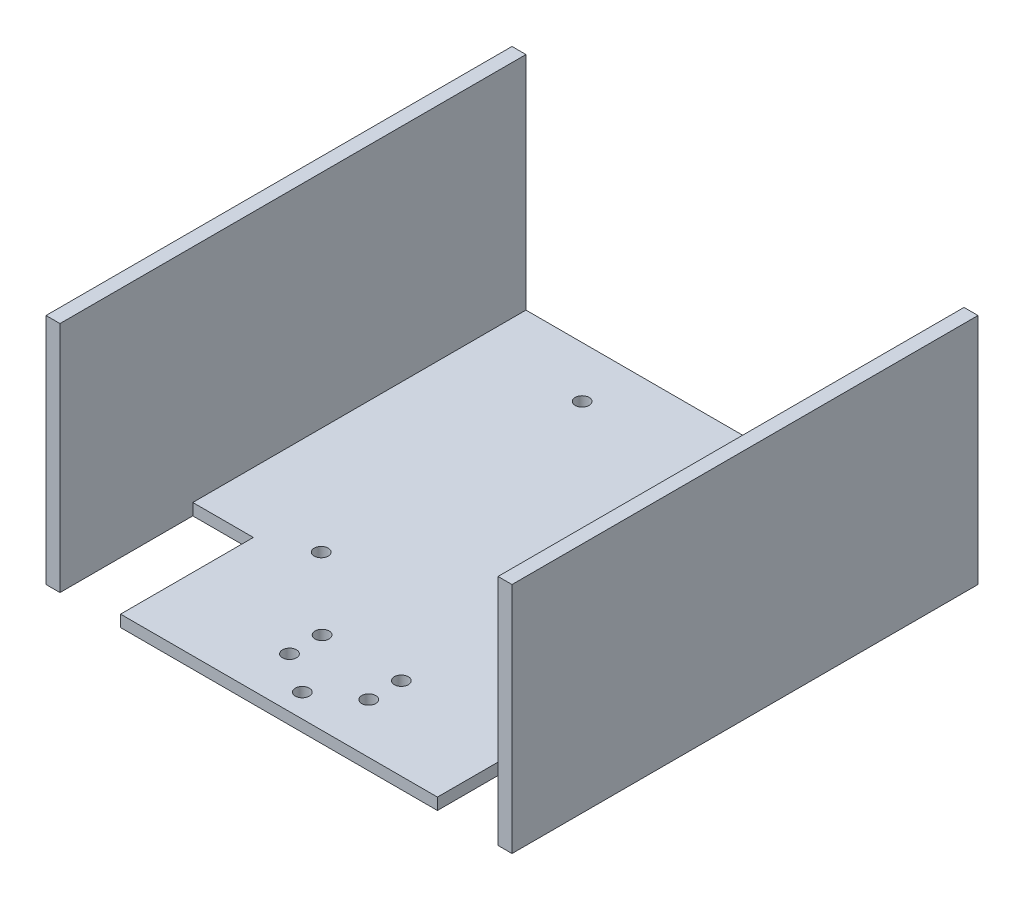
ISO-10303-21;
HEADER;
FILE_DESCRIPTION(('STEP AP214'),'2;1');
FILE_NAME('part.step','',(''),(''),'','','');
FILE_SCHEMA(('AUTOMOTIVE_DESIGN { 1 0 10303 214 1 1 1 1 }'));
ENDSEC;
DATA;
#1=APPLICATION_CONTEXT('core data for automotive mechanical design processes');
#2=APPLICATION_PROTOCOL_DEFINITION('international standard','automotive_design',2000,#1);
#3=PRODUCT_CONTEXT('',#1,'mechanical');
#4=PRODUCT('Part','Part','',(#3));
#5=PRODUCT_RELATED_PRODUCT_CATEGORY('part','',(#4));
#6=PRODUCT_DEFINITION_FORMATION('','',#4);
#7=PRODUCT_DEFINITION_CONTEXT('part definition',#1,'design');
#8=PRODUCT_DEFINITION('design','',#6,#7);
#9=PRODUCT_DEFINITION_SHAPE('','',#8);
#10=(LENGTH_UNIT() NAMED_UNIT(*) SI_UNIT(.MILLI.,.METRE.));
#11=(NAMED_UNIT(*) PLANE_ANGLE_UNIT() SI_UNIT($,.RADIAN.));
#12=(NAMED_UNIT(*) SI_UNIT($,.STERADIAN.) SOLID_ANGLE_UNIT());
#13=UNCERTAINTY_MEASURE_WITH_UNIT(LENGTH_MEASURE(1.E-05),#10,'distance_accuracy_value','');
#14=(GEOMETRIC_REPRESENTATION_CONTEXT(3) GLOBAL_UNCERTAINTY_ASSIGNED_CONTEXT((#13)) GLOBAL_UNIT_ASSIGNED_CONTEXT((#10,
#11,#12)) REPRESENTATION_CONTEXT('',''));
#15=CARTESIAN_POINT('',(0.,0.,0.));
#16=DIRECTION('',(0.,0.,1.));
#17=DIRECTION('',(1.,0.,0.));
#18=AXIS2_PLACEMENT_3D('',#15,#16,#17);
#19=CARTESIAN_POINT('',(0.,0.,0.));
#20=DIRECTION('',(0.,0.,1.));
#21=DIRECTION('',(1.,0.,0.));
#22=AXIS2_PLACEMENT_3D('',#19,#20,#21);
#23=PLANE('',#22);
#24=DIRECTION('',(-1.,0.,0.));
#25=VECTOR('',#24,1.);
#26=CARTESIAN_POINT('',(50.,0.,0.));
#27=LINE('',#26,#25);
#28=CARTESIAN_POINT('',(-47.,0.,0.));
#29=VERTEX_POINT('',#28);
#30=CARTESIAN_POINT('',(-50.,0.,0.));
#31=VERTEX_POINT('',#30);
#32=EDGE_CURVE('E174',#29,#31,#27,.T.);
#33=ORIENTED_EDGE('',*,*,#32,.F.);
#34=DIRECTION('',(0.,-1.,0.));
#35=VECTOR('',#34,1.);
#36=CARTESIAN_POINT('',(-47.,50.,0.));
#37=LINE('',#36,#35);
#38=CARTESIAN_POINT('',(-47.,50.,0.));
#39=VERTEX_POINT('',#38);
#40=EDGE_CURVE('E161',#39,#29,#37,.T.);
#41=ORIENTED_EDGE('',*,*,#40,.F.);
#42=DIRECTION('',(1.,0.,0.));
#43=VECTOR('',#42,1.);
#44=CARTESIAN_POINT('',(-50.,50.,0.));
#45=LINE('',#44,#43);
#46=CARTESIAN_POINT('',(-50.,50.,0.));
#47=VERTEX_POINT('',#46);
#48=EDGE_CURVE('E181',#47,#39,#45,.T.);
#49=ORIENTED_EDGE('',*,*,#48,.F.);
#50=DIRECTION('',(0.,1.,0.));
#51=VECTOR('',#50,1.);
#52=CARTESIAN_POINT('',(-50.,0.,0.));
#53=LINE('',#52,#51);
#54=EDGE_CURVE('E178',#31,#47,#53,.T.);
#55=ORIENTED_EDGE('',*,*,#54,.F.);
#56=EDGE_LOOP('',(#33,#41,#49,#55));
#57=FACE_BOUND('',#56,.T.);
#58=ADVANCED_FACE('F37',(#57),#23,.T.);
#59=DIRECTION('',(0.,-1.,0.));
#60=VECTOR('',#59,1.);
#61=CARTESIAN_POINT('',(47.,50.,0.));
#62=LINE('',#61,#60);
#63=CARTESIAN_POINT('',(47.,50.,0.));
#64=VERTEX_POINT('',#63);
#65=CARTESIAN_POINT('',(47.,0.,0.));
#66=VERTEX_POINT('',#65);
#67=EDGE_CURVE('E160',#64,#66,#62,.T.);
#68=ORIENTED_EDGE('',*,*,#67,.T.);
#69=CARTESIAN_POINT('',(50.,0.,0.));
#70=VERTEX_POINT('',#69);
#71=EDGE_CURVE('E175',#70,#66,#27,.T.);
#72=ORIENTED_EDGE('',*,*,#71,.F.);
#73=DIRECTION('',(0.,1.,0.));
#74=VECTOR('',#73,1.);
#75=CARTESIAN_POINT('',(50.,0.,0.));
#76=LINE('',#75,#74);
#77=CARTESIAN_POINT('',(50.,50.,0.));
#78=VERTEX_POINT('',#77);
#79=EDGE_CURVE('E171',#70,#78,#76,.T.);
#80=ORIENTED_EDGE('',*,*,#79,.T.);
#81=DIRECTION('',(-1.,0.,0.));
#82=VECTOR('',#81,1.);
#83=CARTESIAN_POINT('',(50.,50.,0.));
#84=LINE('',#83,#82);
#85=EDGE_CURVE('E163',#78,#64,#84,.T.);
#86=ORIENTED_EDGE('',*,*,#85,.T.);
#87=EDGE_LOOP('',(#68,#72,#80,#86));
#88=FACE_BOUND('',#87,.T.);
#89=ADVANCED_FACE('F341',(#88),#23,.T.);
#90=CARTESIAN_POINT('',(-47.,50.,-100.));
#91=DIRECTION('',(-1.,0.,0.));
#92=DIRECTION('',(0.,-1.,0.));
#93=AXIS2_PLACEMENT_3D('',#90,#91,#92);
#94=PLANE('',#93);
#95=ORIENTED_EDGE('',*,*,#40,.T.);
#96=DIRECTION('',(0.,0.,1.));
#97=VECTOR('',#96,1.);
#98=CARTESIAN_POINT('',(-47.,0.,-100.));
#99=LINE('',#98,#97);
#100=CARTESIAN_POINT('',(-47.,0.,-28.5));
#101=VERTEX_POINT('',#100);
#102=EDGE_CURVE('E165',#101,#29,#99,.T.);
#103=ORIENTED_EDGE('',*,*,#102,.F.);
#104=DIRECTION('',(0.,1.,0.));
#105=VECTOR('',#104,1.);
#106=CARTESIAN_POINT('',(-47.,-7.5,-28.5));
#107=LINE('',#106,#105);
#108=CARTESIAN_POINT('',(-47.,2.5,-28.5));
#109=VERTEX_POINT('',#108);
#110=EDGE_CURVE('E256',#101,#109,#107,.T.);
#111=ORIENTED_EDGE('',*,*,#110,.T.);
#112=DIRECTION('',(0.,0.,1.));
#113=VECTOR('',#112,1.);
#114=CARTESIAN_POINT('',(-47.,2.5,-100.));
#115=LINE('',#114,#113);
#116=CARTESIAN_POINT('',(-47.,2.5,-100.));
#117=VERTEX_POINT('',#116);
#118=EDGE_CURVE('E203',#117,#109,#115,.T.);
#119=ORIENTED_EDGE('',*,*,#118,.F.);
#120=DIRECTION('',(0.,-1.,0.));
#121=VECTOR('',#120,1.);
#122=CARTESIAN_POINT('',(-47.,50.,-100.));
#123=LINE('',#122,#121);
#124=CARTESIAN_POINT('',(-47.,50.,-100.));
#125=VERTEX_POINT('',#124);
#126=EDGE_CURVE('E183',#125,#117,#123,.T.);
#127=ORIENTED_EDGE('',*,*,#126,.F.);
#128=DIRECTION('',(0.,0.,1.));
#129=VECTOR('',#128,1.);
#130=CARTESIAN_POINT('',(-47.,50.,-100.));
#131=LINE('',#130,#129);
#132=EDGE_CURVE('E184',#125,#39,#131,.T.);
#133=ORIENTED_EDGE('',*,*,#132,.T.);
#134=EDGE_LOOP('',(#95,#103,#111,#119,#127,#133));
#135=FACE_BOUND('',#134,.T.);
#136=ADVANCED_FACE('F39',(#135),#94,.F.);
#137=CARTESIAN_POINT('',(-47.,2.5,-100.));
#138=DIRECTION('',(0.,-1.,0.));
#139=DIRECTION('',(0.,0.,-1.));
#140=AXIS2_PLACEMENT_3D('',#137,#138,#139);
#141=PLANE('',#140);
#142=CARTESIAN_POINT('',(24.,2.5,-89.05));
#143=DIRECTION('',(0.,1.,0.));
#144=DIRECTION('',(0.,0.,-1.));
#145=AXIS2_PLACEMENT_3D('',#142,#143,#144);
#146=CIRCLE('',#145,1.5);
#147=CARTESIAN_POINT('',(24.,2.5,-90.55));
#148=VERTEX_POINT('',#147);
#149=EDGE_CURVE('E380',#148,#148,#146,.T.);
#150=ORIENTED_EDGE('',*,*,#149,.F.);
#151=EDGE_LOOP('',(#150));
#152=FACE_BOUND('',#151,.T.);
#153=CARTESIAN_POINT('',(24.,2.5,-33.05));
#154=DIRECTION('',(0.,1.,0.));
#155=DIRECTION('',(0.,0.,-1.));
#156=AXIS2_PLACEMENT_3D('',#153,#154,#155);
#157=CIRCLE('',#156,1.5);
#158=CARTESIAN_POINT('',(24.,2.5,-34.55));
#159=VERTEX_POINT('',#158);
#160=EDGE_CURVE('E384',#159,#159,#157,.T.);
#161=ORIENTED_EDGE('',*,*,#160,.F.);
#162=EDGE_LOOP('',(#161));
#163=FACE_BOUND('',#162,.T.);
#164=CARTESIAN_POINT('',(-24.,2.5,-33.05));
#165=DIRECTION('',(0.,1.,0.));
#166=DIRECTION('',(0.,0.,1.));
#167=AXIS2_PLACEMENT_3D('',#164,#165,#166);
#168=CIRCLE('',#167,1.5);
#169=CARTESIAN_POINT('',(-24.,2.5,-31.55));
#170=VERTEX_POINT('',#169);
#171=EDGE_CURVE('E388',#170,#170,#168,.T.);
#172=ORIENTED_EDGE('',*,*,#171,.F.);
#173=EDGE_LOOP('',(#172));
#174=FACE_BOUND('',#173,.T.);
#175=CARTESIAN_POINT('',(-24.,2.5,-89.05));
#176=DIRECTION('',(0.,1.,0.));
#177=DIRECTION('',(0.,0.,1.));
#178=AXIS2_PLACEMENT_3D('',#175,#176,#177);
#179=CIRCLE('',#178,1.5);
#180=CARTESIAN_POINT('',(-24.,2.5,-87.55));
#181=VERTEX_POINT('',#180);
#182=EDGE_CURVE('E230',#181,#181,#179,.T.);
#183=ORIENTED_EDGE('',*,*,#182,.F.);
#184=EDGE_LOOP('',(#183));
#185=FACE_BOUND('',#184,.T.);
#186=CARTESIAN_POINT('',(8.5,2.5,-17.75));
#187=DIRECTION('',(0.,1.,0.));
#188=DIRECTION('',(0.,0.,-1.));
#189=AXIS2_PLACEMENT_3D('',#186,#187,#188);
#190=CIRCLE('',#189,1.5);
#191=CARTESIAN_POINT('',(8.5,2.5,-19.25));
#192=VERTEX_POINT('',#191);
#193=EDGE_CURVE('E237',#192,#192,#190,.T.);
#194=ORIENTED_EDGE('',*,*,#193,.F.);
#195=EDGE_LOOP('',(#194));
#196=FACE_BOUND('',#195,.T.);
#197=CARTESIAN_POINT('',(8.5,2.5,-10.75));
#198=DIRECTION('',(0.,1.,0.));
#199=DIRECTION('',(0.,0.,-1.));
#200=AXIS2_PLACEMENT_3D('',#197,#198,#199);
#201=CIRCLE('',#200,1.5);
#202=CARTESIAN_POINT('',(8.5,2.5,-12.25));
#203=VERTEX_POINT('',#202);
#204=EDGE_CURVE('E241',#203,#203,#201,.T.);
#205=ORIENTED_EDGE('',*,*,#204,.F.);
#206=EDGE_LOOP('',(#205));
#207=FACE_BOUND('',#206,.T.);
#208=CARTESIAN_POINT('',(-8.5,2.5,-10.75));
#209=DIRECTION('',(0.,1.,0.));
#210=DIRECTION('',(0.,0.,1.));
#211=AXIS2_PLACEMENT_3D('',#208,#209,#210);
#212=CIRCLE('',#211,1.5);
#213=CARTESIAN_POINT('',(-8.5,2.5,-9.25));
#214=VERTEX_POINT('',#213);
#215=EDGE_CURVE('E246',#214,#214,#212,.T.);
#216=ORIENTED_EDGE('',*,*,#215,.F.);
#217=EDGE_LOOP('',(#216));
#218=FACE_BOUND('',#217,.T.);
#219=CARTESIAN_POINT('',(-8.5,2.5,-17.75));
#220=DIRECTION('',(0.,1.,0.));
#221=DIRECTION('',(0.,0.,1.));
#222=AXIS2_PLACEMENT_3D('',#219,#220,#221);
#223=CIRCLE('',#222,1.5);
#224=CARTESIAN_POINT('',(-8.5,2.5,-16.25));
#225=VERTEX_POINT('',#224);
#226=EDGE_CURVE('E217',#225,#225,#223,.T.);
#227=ORIENTED_EDGE('',*,*,#226,.F.);
#228=EDGE_LOOP('',(#227));
#229=FACE_BOUND('',#228,.T.);
#230=CARTESIAN_POINT('',(0.,2.5,-5.));
#231=DIRECTION('',(0.,1.,0.));
#232=DIRECTION('',(0.,0.,1.));
#233=AXIS2_PLACEMENT_3D('',#230,#231,#232);
#234=CIRCLE('',#233,1.5);
#235=CARTESIAN_POINT('',(0.,2.5,-3.5));
#236=VERTEX_POINT('',#235);
#237=EDGE_CURVE('E212',#236,#236,#234,.T.);
#238=ORIENTED_EDGE('',*,*,#237,.F.);
#239=EDGE_LOOP('',(#238));
#240=FACE_BOUND('',#239,.T.);
#241=ORIENTED_EDGE('',*,*,#118,.T.);
#242=DIRECTION('',(-1.,0.,0.));
#243=VECTOR('',#242,1.);
#244=CARTESIAN_POINT('',(-47.,2.5,-28.5));
#245=LINE('',#244,#243);
#246=CARTESIAN_POINT('',(-34.,2.5,-28.5));
#247=VERTEX_POINT('',#246);
#248=EDGE_CURVE('E156',#247,#109,#245,.T.);
#249=ORIENTED_EDGE('',*,*,#248,.F.);
#250=DIRECTION('',(0.,0.,-1.));
#251=VECTOR('',#250,1.);
#252=CARTESIAN_POINT('',(-34.,2.5,0.));
#253=LINE('',#252,#251);
#254=CARTESIAN_POINT('',(-34.,2.5,0.));
#255=VERTEX_POINT('',#254);
#256=EDGE_CURVE('E142',#255,#247,#253,.T.);
#257=ORIENTED_EDGE('',*,*,#256,.F.);
#258=DIRECTION('',(1.,0.,0.));
#259=VECTOR('',#258,1.);
#260=CARTESIAN_POINT('',(-47.,2.5,0.));
#261=LINE('',#260,#259);
#262=CARTESIAN_POINT('',(34.,2.5,0.));
#263=VERTEX_POINT('',#262);
#264=EDGE_CURVE('E154',#255,#263,#261,.T.);
#265=ORIENTED_EDGE('',*,*,#264,.T.);
#266=DIRECTION('',(0.,0.,1.));
#267=VECTOR('',#266,1.);
#268=CARTESIAN_POINT('',(34.,2.5,0.));
#269=LINE('',#268,#267);
#270=CARTESIAN_POINT('',(34.,2.5,-28.5));
#271=VERTEX_POINT('',#270);
#272=EDGE_CURVE('E54',#271,#263,#269,.T.);
#273=ORIENTED_EDGE('',*,*,#272,.F.);
#274=DIRECTION('',(-1.,0.,0.));
#275=VECTOR('',#274,1.);
#276=CARTESIAN_POINT('',(47.,2.5,-28.5));
#277=LINE('',#276,#275);
#278=CARTESIAN_POINT('',(47.,2.5,-28.5));
#279=VERTEX_POINT('',#278);
#280=EDGE_CURVE('E211',#279,#271,#277,.T.);
#281=ORIENTED_EDGE('',*,*,#280,.F.);
#282=DIRECTION('',(0.,0.,1.));
#283=VECTOR('',#282,1.);
#284=CARTESIAN_POINT('',(47.,2.5,-100.));
#285=LINE('',#284,#283);
#286=CARTESIAN_POINT('',(47.,2.5,-100.));
#287=VERTEX_POINT('',#286);
#288=EDGE_CURVE('E200',#287,#279,#285,.T.);
#289=ORIENTED_EDGE('',*,*,#288,.F.);
#290=DIRECTION('',(1.,0.,0.));
#291=VECTOR('',#290,1.);
#292=CARTESIAN_POINT('',(-47.,2.5,-100.));
#293=LINE('',#292,#291);
#294=EDGE_CURVE('E276',#117,#287,#293,.T.);
#295=ORIENTED_EDGE('',*,*,#294,.F.);
#296=EDGE_LOOP('',(#241,#249,#257,#265,#273,#281,#289,#295));
#297=FACE_BOUND('',#296,.T.);
#298=ADVANCED_FACE('F153',(#152,#163,#174,#185,#196,#207,#218,#229,#240,#297),#141,.F.);
#299=CARTESIAN_POINT('',(47.,50.,-100.));
#300=DIRECTION('',(-1.,0.,0.));
#301=DIRECTION('',(0.,-1.,0.));
#302=AXIS2_PLACEMENT_3D('',#299,#300,#301);
#303=PLANE('',#302);
#304=ORIENTED_EDGE('',*,*,#67,.F.);
#305=DIRECTION('',(0.,0.,1.));
#306=VECTOR('',#305,1.);
#307=CARTESIAN_POINT('',(47.,50.,-100.));
#308=LINE('',#307,#306);
#309=CARTESIAN_POINT('',(47.,50.,-100.));
#310=VERTEX_POINT('',#309);
#311=EDGE_CURVE('E198',#310,#64,#308,.T.);
#312=ORIENTED_EDGE('',*,*,#311,.F.);
#313=DIRECTION('',(0.,-1.,0.));
#314=VECTOR('',#313,1.);
#315=CARTESIAN_POINT('',(47.,50.,-100.));
#316=LINE('',#315,#314);
#317=EDGE_CURVE('E278',#310,#287,#316,.T.);
#318=ORIENTED_EDGE('',*,*,#317,.T.);
#319=ORIENTED_EDGE('',*,*,#288,.T.);
#320=DIRECTION('',(0.,1.,0.));
#321=VECTOR('',#320,1.);
#322=CARTESIAN_POINT('',(47.,-7.5,-28.5));
#323=LINE('',#322,#321);
#324=CARTESIAN_POINT('',(47.,0.,-28.5));
#325=VERTEX_POINT('',#324);
#326=EDGE_CURVE('E263',#325,#279,#323,.T.);
#327=ORIENTED_EDGE('',*,*,#326,.F.);
#328=DIRECTION('',(0.,0.,-1.));
#329=VECTOR('',#328,1.);
#330=CARTESIAN_POINT('',(47.,0.,-100.));
#331=LINE('',#330,#329);
#332=EDGE_CURVE('E268',#66,#325,#331,.T.);
#333=ORIENTED_EDGE('',*,*,#332,.F.);
#334=EDGE_LOOP('',(#304,#312,#318,#319,#327,#333));
#335=FACE_BOUND('',#334,.T.);
#336=ADVANCED_FACE('F370',(#335),#303,.T.);
#337=CARTESIAN_POINT('',(50.,50.,-100.));
#338=DIRECTION('',(0.,1.,0.));
#339=DIRECTION('',(-1.,0.,0.));
#340=AXIS2_PLACEMENT_3D('',#337,#338,#339);
#341=PLANE('',#340);
#342=ORIENTED_EDGE('',*,*,#85,.F.);
#343=DIRECTION('',(0.,0.,1.));
#344=VECTOR('',#343,1.);
#345=CARTESIAN_POINT('',(50.,50.,-100.));
#346=LINE('',#345,#344);
#347=CARTESIAN_POINT('',(50.,50.,-100.));
#348=VERTEX_POINT('',#347);
#349=EDGE_CURVE('E196',#348,#78,#346,.T.);
#350=ORIENTED_EDGE('',*,*,#349,.F.);
#351=DIRECTION('',(-1.,0.,0.));
#352=VECTOR('',#351,1.);
#353=CARTESIAN_POINT('',(50.,50.,-100.));
#354=LINE('',#353,#352);
#355=EDGE_CURVE('E281',#348,#310,#354,.T.);
#356=ORIENTED_EDGE('',*,*,#355,.T.);
#357=ORIENTED_EDGE('',*,*,#311,.T.);
#358=EDGE_LOOP('',(#342,#350,#356,#357));
#359=FACE_BOUND('',#358,.T.);
#360=ADVANCED_FACE('F312',(#359),#341,.T.);
#361=CARTESIAN_POINT('',(50.,0.,-100.));
#362=DIRECTION('',(1.,0.,0.));
#363=DIRECTION('',(0.,0.,-1.));
#364=AXIS2_PLACEMENT_3D('',#361,#362,#363);
#365=PLANE('',#364);
#366=ORIENTED_EDGE('',*,*,#79,.F.);
#367=DIRECTION('',(0.,0.,1.));
#368=VECTOR('',#367,1.);
#369=CARTESIAN_POINT('',(50.,0.,-100.));
#370=LINE('',#369,#368);
#371=CARTESIAN_POINT('',(50.,0.,-100.));
#372=VERTEX_POINT('',#371);
#373=EDGE_CURVE('E194',#372,#70,#370,.T.);
#374=ORIENTED_EDGE('',*,*,#373,.F.);
#375=DIRECTION('',(0.,1.,0.));
#376=VECTOR('',#375,1.);
#377=CARTESIAN_POINT('',(50.,0.,-100.));
#378=LINE('',#377,#376);
#379=EDGE_CURVE('E284',#372,#348,#378,.T.);
#380=ORIENTED_EDGE('',*,*,#379,.T.);
#381=ORIENTED_EDGE('',*,*,#349,.T.);
#382=EDGE_LOOP('',(#366,#374,#380,#381));
#383=FACE_BOUND('',#382,.T.);
#384=ADVANCED_FACE('F316',(#383),#365,.T.);
#385=CARTESIAN_POINT('',(50.,0.,-100.));
#386=DIRECTION('',(0.,1.,0.));
#387=DIRECTION('',(-1.,0.,0.));
#388=AXIS2_PLACEMENT_3D('',#385,#386,#387);
#389=PLANE('',#388);
#390=CARTESIAN_POINT('',(24.,0.,-89.05));
#391=DIRECTION('',(0.,1.,0.));
#392=DIRECTION('',(-1.,0.,0.));
#393=AXIS2_PLACEMENT_3D('',#390,#391,#392);
#394=CIRCLE('',#393,1.5);
#395=CARTESIAN_POINT('',(22.5,0.,-89.05));
#396=VERTEX_POINT('',#395);
#397=EDGE_CURVE('E41',#396,#396,#394,.T.);
#398=ORIENTED_EDGE('',*,*,#397,.T.);
#399=EDGE_LOOP('',(#398));
#400=FACE_BOUND('',#399,.T.);
#401=CARTESIAN_POINT('',(24.,0.,-33.05));
#402=DIRECTION('',(0.,1.,0.));
#403=DIRECTION('',(-1.,0.,0.));
#404=AXIS2_PLACEMENT_3D('',#401,#402,#403);
#405=CIRCLE('',#404,1.5);
#406=CARTESIAN_POINT('',(22.5,0.,-33.05));
#407=VERTEX_POINT('',#406);
#408=EDGE_CURVE('E232',#407,#407,#405,.T.);
#409=ORIENTED_EDGE('',*,*,#408,.T.);
#410=EDGE_LOOP('',(#409));
#411=FACE_BOUND('',#410,.T.);
#412=CARTESIAN_POINT('',(-24.,0.,-33.05));
#413=DIRECTION('',(0.,1.,0.));
#414=DIRECTION('',(-1.,0.,0.));
#415=AXIS2_PLACEMENT_3D('',#412,#413,#414);
#416=CIRCLE('',#415,1.5);
#417=CARTESIAN_POINT('',(-25.5,0.,-33.05));
#418=VERTEX_POINT('',#417);
#419=EDGE_CURVE('E229',#418,#418,#416,.T.);
#420=ORIENTED_EDGE('',*,*,#419,.T.);
#421=EDGE_LOOP('',(#420));
#422=FACE_BOUND('',#421,.T.);
#423=CARTESIAN_POINT('',(-24.,0.,-89.05));
#424=DIRECTION('',(0.,1.,0.));
#425=DIRECTION('',(-1.,0.,0.));
#426=AXIS2_PLACEMENT_3D('',#423,#424,#425);
#427=CIRCLE('',#426,1.5);
#428=CARTESIAN_POINT('',(-25.5,0.,-89.05));
#429=VERTEX_POINT('',#428);
#430=EDGE_CURVE('E226',#429,#429,#427,.T.);
#431=ORIENTED_EDGE('',*,*,#430,.T.);
#432=EDGE_LOOP('',(#431));
#433=FACE_BOUND('',#432,.T.);
#434=CARTESIAN_POINT('',(8.5,0.,-17.75));
#435=DIRECTION('',(0.,1.,0.));
#436=DIRECTION('',(-1.,0.,0.));
#437=AXIS2_PLACEMENT_3D('',#434,#435,#436);
#438=CIRCLE('',#437,1.5);
#439=CARTESIAN_POINT('',(7.,0.,-17.75));
#440=VERTEX_POINT('',#439);
#441=EDGE_CURVE('E223',#440,#440,#438,.T.);
#442=ORIENTED_EDGE('',*,*,#441,.T.);
#443=EDGE_LOOP('',(#442));
#444=FACE_BOUND('',#443,.T.);
#445=CARTESIAN_POINT('',(8.5,0.,-10.75));
#446=DIRECTION('',(0.,1.,0.));
#447=DIRECTION('',(-1.,0.,0.));
#448=AXIS2_PLACEMENT_3D('',#445,#446,#447);
#449=CIRCLE('',#448,1.5);
#450=CARTESIAN_POINT('',(7.,0.,-10.75));
#451=VERTEX_POINT('',#450);
#452=EDGE_CURVE('E220',#451,#451,#449,.T.);
#453=ORIENTED_EDGE('',*,*,#452,.T.);
#454=EDGE_LOOP('',(#453));
#455=FACE_BOUND('',#454,.T.);
#456=CARTESIAN_POINT('',(-8.5,0.,-10.75));
#457=DIRECTION('',(0.,1.,0.));
#458=DIRECTION('',(-1.,0.,0.));
#459=AXIS2_PLACEMENT_3D('',#456,#457,#458);
#460=CIRCLE('',#459,1.5);
#461=CARTESIAN_POINT('',(-10.,0.,-10.75));
#462=VERTEX_POINT('',#461);
#463=EDGE_CURVE('E216',#462,#462,#460,.T.);
#464=ORIENTED_EDGE('',*,*,#463,.T.);
#465=EDGE_LOOP('',(#464));
#466=FACE_BOUND('',#465,.T.);
#467=CARTESIAN_POINT('',(-8.5,0.,-17.75));
#468=DIRECTION('',(0.,1.,0.));
#469=DIRECTION('',(-1.,0.,0.));
#470=AXIS2_PLACEMENT_3D('',#467,#468,#469);
#471=CIRCLE('',#470,1.5);
#472=CARTESIAN_POINT('',(-10.,0.,-17.75));
#473=VERTEX_POINT('',#472);
#474=EDGE_CURVE('E213',#473,#473,#471,.T.);
#475=ORIENTED_EDGE('',*,*,#474,.T.);
#476=EDGE_LOOP('',(#475));
#477=FACE_BOUND('',#476,.T.);
#478=CARTESIAN_POINT('',(0.,0.,-5.));
#479=DIRECTION('',(0.,1.,0.));
#480=DIRECTION('',(-1.,0.,0.));
#481=AXIS2_PLACEMENT_3D('',#478,#479,#480);
#482=CIRCLE('',#481,1.5);
#483=CARTESIAN_POINT('',(-1.5,0.,-5.));
#484=VERTEX_POINT('',#483);
#485=EDGE_CURVE('E208',#484,#484,#482,.T.);
#486=ORIENTED_EDGE('',*,*,#485,.T.);
#487=EDGE_LOOP('',(#486));
#488=FACE_BOUND('',#487,.T.);
#489=DIRECTION('',(-1.,0.,0.));
#490=VECTOR('',#489,1.);
#491=CARTESIAN_POINT('',(50.,0.,-28.5));
#492=LINE('',#491,#490);
#493=CARTESIAN_POINT('',(-34.,0.,-28.5));
#494=VERTEX_POINT('',#493);
#495=EDGE_CURVE('E11',#494,#101,#492,.T.);
#496=ORIENTED_EDGE('',*,*,#495,.T.);
#497=ORIENTED_EDGE('',*,*,#102,.T.);
#498=ORIENTED_EDGE('',*,*,#32,.T.);
#499=DIRECTION('',(0.,0.,1.));
#500=VECTOR('',#499,1.);
#501=CARTESIAN_POINT('',(-50.,0.,-100.));
#502=LINE('',#501,#500);
#503=CARTESIAN_POINT('',(-50.,0.,-100.));
#504=VERTEX_POINT('',#503);
#505=EDGE_CURVE('E191',#504,#31,#502,.T.);
#506=ORIENTED_EDGE('',*,*,#505,.F.);
#507=DIRECTION('',(-1.,0.,0.));
#508=VECTOR('',#507,1.);
#509=CARTESIAN_POINT('',(50.,0.,-100.));
#510=LINE('',#509,#508);
#511=EDGE_CURVE('E287',#372,#504,#510,.T.);
#512=ORIENTED_EDGE('',*,*,#511,.F.);
#513=ORIENTED_EDGE('',*,*,#373,.T.);
#514=ORIENTED_EDGE('',*,*,#71,.T.);
#515=ORIENTED_EDGE('',*,*,#332,.T.);
#516=DIRECTION('',(-1.,0.,0.));
#517=VECTOR('',#516,1.);
#518=CARTESIAN_POINT('',(50.,0.,-28.5));
#519=LINE('',#518,#517);
#520=CARTESIAN_POINT('',(34.,0.,-28.5));
#521=VERTEX_POINT('',#520);
#522=EDGE_CURVE('E46',#325,#521,#519,.T.);
#523=ORIENTED_EDGE('',*,*,#522,.T.);
#524=DIRECTION('',(0.,0.,1.));
#525=VECTOR('',#524,1.);
#526=CARTESIAN_POINT('',(34.,0.,-100.));
#527=LINE('',#526,#525);
#528=CARTESIAN_POINT('',(34.,0.,0.));
#529=VERTEX_POINT('',#528);
#530=EDGE_CURVE('E258',#521,#529,#527,.T.);
#531=ORIENTED_EDGE('',*,*,#530,.T.);
#532=CARTESIAN_POINT('',(-34.,0.,0.));
#533=VERTEX_POINT('',#532);
#534=EDGE_CURVE('E179',#529,#533,#27,.T.);
#535=ORIENTED_EDGE('',*,*,#534,.T.);
#536=DIRECTION('',(0.,0.,-1.));
#537=VECTOR('',#536,1.);
#538=CARTESIAN_POINT('',(-34.,0.,-100.));
#539=LINE('',#538,#537);
#540=EDGE_CURVE('E62',#533,#494,#539,.T.);
#541=ORIENTED_EDGE('',*,*,#540,.T.);
#542=EDGE_LOOP('',(#496,#497,#498,#506,#512,#513,#514,#515,#523,#531,#535,#541));
#543=FACE_BOUND('',#542,.T.);
#544=ADVANCED_FACE('F320',(#400,#411,#422,#433,#444,#455,#466,#477,#488,#543),#389,.F.);
#545=CARTESIAN_POINT('',(-50.,0.,-100.));
#546=DIRECTION('',(1.,0.,0.));
#547=DIRECTION('',(0.,0.,-1.));
#548=AXIS2_PLACEMENT_3D('',#545,#546,#547);
#549=PLANE('',#548);
#550=ORIENTED_EDGE('',*,*,#54,.T.);
#551=DIRECTION('',(0.,0.,1.));
#552=VECTOR('',#551,1.);
#553=CARTESIAN_POINT('',(-50.,50.,-100.));
#554=LINE('',#553,#552);
#555=CARTESIAN_POINT('',(-50.,50.,-100.));
#556=VERTEX_POINT('',#555);
#557=EDGE_CURVE('E187',#556,#47,#554,.T.);
#558=ORIENTED_EDGE('',*,*,#557,.F.);
#559=DIRECTION('',(0.,1.,0.));
#560=VECTOR('',#559,1.);
#561=CARTESIAN_POINT('',(-50.,0.,-100.));
#562=LINE('',#561,#560);
#563=EDGE_CURVE('E289',#504,#556,#562,.T.);
#564=ORIENTED_EDGE('',*,*,#563,.F.);
#565=ORIENTED_EDGE('',*,*,#505,.T.);
#566=EDGE_LOOP('',(#550,#558,#564,#565));
#567=FACE_BOUND('',#566,.T.);
#568=ADVANCED_FACE('F324',(#567),#549,.F.);
#569=CARTESIAN_POINT('',(-50.,50.,-100.));
#570=DIRECTION('',(0.,-1.,0.));
#571=DIRECTION('',(1.,0.,0.));
#572=AXIS2_PLACEMENT_3D('',#569,#570,#571);
#573=PLANE('',#572);
#574=ORIENTED_EDGE('',*,*,#48,.T.);
#575=ORIENTED_EDGE('',*,*,#132,.F.);
#576=DIRECTION('',(1.,0.,0.));
#577=VECTOR('',#576,1.);
#578=CARTESIAN_POINT('',(-50.,50.,-100.));
#579=LINE('',#578,#577);
#580=EDGE_CURVE('E188',#556,#125,#579,.T.);
#581=ORIENTED_EDGE('',*,*,#580,.F.);
#582=ORIENTED_EDGE('',*,*,#557,.T.);
#583=EDGE_LOOP('',(#574,#575,#581,#582));
#584=FACE_BOUND('',#583,.T.);
#585=ADVANCED_FACE('F299',(#584),#573,.F.);
#586=CARTESIAN_POINT('',(0.,0.,-100.));
#587=DIRECTION('',(0.,0.,1.));
#588=DIRECTION('',(1.,0.,0.));
#589=AXIS2_PLACEMENT_3D('',#586,#587,#588);
#590=PLANE('',#589);
#591=ORIENTED_EDGE('',*,*,#126,.T.);
#592=ORIENTED_EDGE('',*,*,#294,.T.);
#593=ORIENTED_EDGE('',*,*,#317,.F.);
#594=ORIENTED_EDGE('',*,*,#355,.F.);
#595=ORIENTED_EDGE('',*,*,#379,.F.);
#596=ORIENTED_EDGE('',*,*,#511,.T.);
#597=ORIENTED_EDGE('',*,*,#563,.T.);
#598=ORIENTED_EDGE('',*,*,#580,.T.);
#599=EDGE_LOOP('',(#591,#592,#593,#594,#595,#596,#597,#598));
#600=FACE_BOUND('',#599,.T.);
#601=ADVANCED_FACE('F293',(#600),#590,.F.);
#602=DIRECTION('',(0.,1.,0.));
#603=VECTOR('',#602,1.);
#604=CARTESIAN_POINT('',(-34.,0.,0.));
#605=LINE('',#604,#603);
#606=EDGE_CURVE('E139',#533,#255,#605,.T.);
#607=ORIENTED_EDGE('',*,*,#606,.F.);
#608=ORIENTED_EDGE('',*,*,#534,.F.);
#609=DIRECTION('',(0.,-1.,0.));
#610=VECTOR('',#609,1.);
#611=CARTESIAN_POINT('',(34.,0.,0.));
#612=LINE('',#611,#610);
#613=EDGE_CURVE('E148',#263,#529,#612,.T.);
#614=ORIENTED_EDGE('',*,*,#613,.F.);
#615=ORIENTED_EDGE('',*,*,#264,.F.);
#616=EDGE_LOOP('',(#607,#608,#614,#615));
#617=FACE_BOUND('',#616,.T.);
#618=ADVANCED_FACE('F159',(#617),#23,.T.);
#619=CARTESIAN_POINT('',(47.,-7.5,-28.5));
#620=DIRECTION('',(0.,0.,-1.));
#621=DIRECTION('',(-1.,0.,0.));
#622=AXIS2_PLACEMENT_3D('',#619,#620,#621);
#623=PLANE('',#622);
#624=ORIENTED_EDGE('',*,*,#326,.T.);
#625=ORIENTED_EDGE('',*,*,#280,.T.);
#626=DIRECTION('',(0.,1.,0.));
#627=VECTOR('',#626,1.);
#628=CARTESIAN_POINT('',(34.,-7.5,-28.5));
#629=LINE('',#628,#627);
#630=EDGE_CURVE('E157',#521,#271,#629,.T.);
#631=ORIENTED_EDGE('',*,*,#630,.F.);
#632=ORIENTED_EDGE('',*,*,#522,.F.);
#633=EDGE_LOOP('',(#624,#625,#631,#632));
#634=FACE_BOUND('',#633,.T.);
#635=ADVANCED_FACE('F337',(#634),#623,.F.);
#636=CARTESIAN_POINT('',(34.,-7.5,0.));
#637=DIRECTION('',(-1.,0.,0.));
#638=DIRECTION('',(0.,0.,1.));
#639=AXIS2_PLACEMENT_3D('',#636,#637,#638);
#640=PLANE('',#639);
#641=ORIENTED_EDGE('',*,*,#630,.T.);
#642=ORIENTED_EDGE('',*,*,#272,.T.);
#643=ORIENTED_EDGE('',*,*,#613,.T.);
#644=ORIENTED_EDGE('',*,*,#530,.F.);
#645=EDGE_LOOP('',(#641,#642,#643,#644));
#646=FACE_BOUND('',#645,.T.);
#647=ADVANCED_FACE('F329',(#646),#640,.F.);
#648=CARTESIAN_POINT('',(-47.,-7.5,-28.5));
#649=DIRECTION('',(0.,0.,-1.));
#650=DIRECTION('',(-1.,0.,0.));
#651=AXIS2_PLACEMENT_3D('',#648,#649,#650);
#652=PLANE('',#651);
#653=DIRECTION('',(0.,1.,0.));
#654=VECTOR('',#653,1.);
#655=CARTESIAN_POINT('',(-34.,-7.5,-28.5));
#656=LINE('',#655,#654);
#657=EDGE_CURVE('E255',#494,#247,#656,.T.);
#658=ORIENTED_EDGE('',*,*,#657,.T.);
#659=ORIENTED_EDGE('',*,*,#248,.T.);
#660=ORIENTED_EDGE('',*,*,#110,.F.);
#661=ORIENTED_EDGE('',*,*,#495,.F.);
#662=EDGE_LOOP('',(#658,#659,#660,#661));
#663=FACE_BOUND('',#662,.T.);
#664=ADVANCED_FACE('F327',(#663),#652,.F.);
#665=CARTESIAN_POINT('',(-34.,-7.5,0.));
#666=DIRECTION('',(1.,0.,0.));
#667=DIRECTION('',(0.,0.,-1.));
#668=AXIS2_PLACEMENT_3D('',#665,#666,#667);
#669=PLANE('',#668);
#670=ORIENTED_EDGE('',*,*,#606,.T.);
#671=ORIENTED_EDGE('',*,*,#256,.T.);
#672=ORIENTED_EDGE('',*,*,#657,.F.);
#673=ORIENTED_EDGE('',*,*,#540,.F.);
#674=EDGE_LOOP('',(#670,#671,#672,#673));
#675=FACE_BOUND('',#674,.T.);
#676=ADVANCED_FACE('F141',(#675),#669,.F.);
#677=CARTESIAN_POINT('',(0.,-2.5,-5.));
#678=DIRECTION('',(0.,1.,0.));
#679=DIRECTION('',(0.,0.,1.));
#680=AXIS2_PLACEMENT_3D('',#677,#678,#679);
#681=CYLINDRICAL_SURFACE('',#680,1.5);
#682=ORIENTED_EDGE('',*,*,#237,.T.);
#683=EDGE_LOOP('',(#682));
#684=FACE_BOUND('',#683,.T.);
#685=ORIENTED_EDGE('',*,*,#485,.F.);
#686=EDGE_LOOP('',(#685));
#687=FACE_BOUND('',#686,.T.);
#688=ADVANCED_FACE('F335',(#684,#687),#681,.F.);
#689=CARTESIAN_POINT('',(-8.5,-7.5,-17.75));
#690=DIRECTION('',(0.,1.,0.));
#691=DIRECTION('',(0.,0.,1.));
#692=AXIS2_PLACEMENT_3D('',#689,#690,#691);
#693=CYLINDRICAL_SURFACE('',#692,1.5);
#694=ORIENTED_EDGE('',*,*,#226,.T.);
#695=EDGE_LOOP('',(#694));
#696=FACE_BOUND('',#695,.T.);
#697=ORIENTED_EDGE('',*,*,#474,.F.);
#698=EDGE_LOOP('',(#697));
#699=FACE_BOUND('',#698,.T.);
#700=ADVANCED_FACE('F404',(#696,#699),#693,.F.);
#701=CARTESIAN_POINT('',(-8.5,-7.5,-10.75));
#702=DIRECTION('',(0.,1.,0.));
#703=DIRECTION('',(0.,0.,1.));
#704=AXIS2_PLACEMENT_3D('',#701,#702,#703);
#705=CYLINDRICAL_SURFACE('',#704,1.5);
#706=ORIENTED_EDGE('',*,*,#215,.T.);
#707=EDGE_LOOP('',(#706));
#708=FACE_BOUND('',#707,.T.);
#709=ORIENTED_EDGE('',*,*,#463,.F.);
#710=EDGE_LOOP('',(#709));
#711=FACE_BOUND('',#710,.T.);
#712=ADVANCED_FACE('F410',(#708,#711),#705,.F.);
#713=CARTESIAN_POINT('',(8.5,-7.5,-10.75));
#714=DIRECTION('',(0.,1.,0.));
#715=DIRECTION('',(0.,0.,1.));
#716=AXIS2_PLACEMENT_3D('',#713,#714,#715);
#717=CYLINDRICAL_SURFACE('',#716,1.5);
#718=ORIENTED_EDGE('',*,*,#204,.T.);
#719=EDGE_LOOP('',(#718));
#720=FACE_BOUND('',#719,.T.);
#721=ORIENTED_EDGE('',*,*,#452,.F.);
#722=EDGE_LOOP('',(#721));
#723=FACE_BOUND('',#722,.T.);
#724=ADVANCED_FACE('F418',(#720,#723),#717,.F.);
#725=CARTESIAN_POINT('',(8.5,-7.5,-17.75));
#726=DIRECTION('',(0.,1.,0.));
#727=DIRECTION('',(0.,0.,1.));
#728=AXIS2_PLACEMENT_3D('',#725,#726,#727);
#729=CYLINDRICAL_SURFACE('',#728,1.5);
#730=ORIENTED_EDGE('',*,*,#193,.T.);
#731=EDGE_LOOP('',(#730));
#732=FACE_BOUND('',#731,.T.);
#733=ORIENTED_EDGE('',*,*,#441,.F.);
#734=EDGE_LOOP('',(#733));
#735=FACE_BOUND('',#734,.T.);
#736=ADVANCED_FACE('F414',(#732,#735),#729,.F.);
#737=CARTESIAN_POINT('',(-24.,-7.5,-89.05));
#738=DIRECTION('',(0.,1.,0.));
#739=DIRECTION('',(0.,0.,1.));
#740=AXIS2_PLACEMENT_3D('',#737,#738,#739);
#741=CYLINDRICAL_SURFACE('',#740,1.5);
#742=ORIENTED_EDGE('',*,*,#182,.T.);
#743=EDGE_LOOP('',(#742));
#744=FACE_BOUND('',#743,.T.);
#745=ORIENTED_EDGE('',*,*,#430,.F.);
#746=EDGE_LOOP('',(#745));
#747=FACE_BOUND('',#746,.T.);
#748=ADVANCED_FACE('F417',(#744,#747),#741,.F.);
#749=CARTESIAN_POINT('',(-24.,-7.5,-33.05));
#750=DIRECTION('',(0.,1.,0.));
#751=DIRECTION('',(0.,0.,1.));
#752=AXIS2_PLACEMENT_3D('',#749,#750,#751);
#753=CYLINDRICAL_SURFACE('',#752,1.5);
#754=ORIENTED_EDGE('',*,*,#171,.T.);
#755=EDGE_LOOP('',(#754));
#756=FACE_BOUND('',#755,.T.);
#757=ORIENTED_EDGE('',*,*,#419,.F.);
#758=EDGE_LOOP('',(#757));
#759=FACE_BOUND('',#758,.T.);
#760=ADVANCED_FACE('F427',(#756,#759),#753,.F.);
#761=CARTESIAN_POINT('',(24.,-7.5,-33.05));
#762=DIRECTION('',(0.,1.,0.));
#763=DIRECTION('',(0.,0.,1.));
#764=AXIS2_PLACEMENT_3D('',#761,#762,#763);
#765=CYLINDRICAL_SURFACE('',#764,1.5);
#766=ORIENTED_EDGE('',*,*,#160,.T.);
#767=EDGE_LOOP('',(#766));
#768=FACE_BOUND('',#767,.T.);
#769=ORIENTED_EDGE('',*,*,#408,.F.);
#770=EDGE_LOOP('',(#769));
#771=FACE_BOUND('',#770,.T.);
#772=ADVANCED_FACE('F432',(#768,#771),#765,.F.);
#773=CARTESIAN_POINT('',(24.,-7.5,-89.05));
#774=DIRECTION('',(0.,1.,0.));
#775=DIRECTION('',(0.,0.,1.));
#776=AXIS2_PLACEMENT_3D('',#773,#774,#775);
#777=CYLINDRICAL_SURFACE('',#776,1.5);
#778=ORIENTED_EDGE('',*,*,#149,.T.);
#779=EDGE_LOOP('',(#778));
#780=FACE_BOUND('',#779,.T.);
#781=ORIENTED_EDGE('',*,*,#397,.F.);
#782=EDGE_LOOP('',(#781));
#783=FACE_BOUND('',#782,.T.);
#784=ADVANCED_FACE('F429',(#780,#783),#777,.F.);
#785=CLOSED_SHELL('',(#58,#89,#136,#298,#336,#360,#384,#544,#568,#585,#601,#618,#635,#647,#664,
#676,#688,#700,#712,#724,#736,#748,#760,#772,#784));
#786=MANIFOLD_SOLID_BREP('B2',#785);
#787=ADVANCED_BREP_SHAPE_REPRESENTATION('',(#18,#786),#14);
#788=SHAPE_DEFINITION_REPRESENTATION(#9,#787);
ENDSEC;
END-ISO-10303-21;
